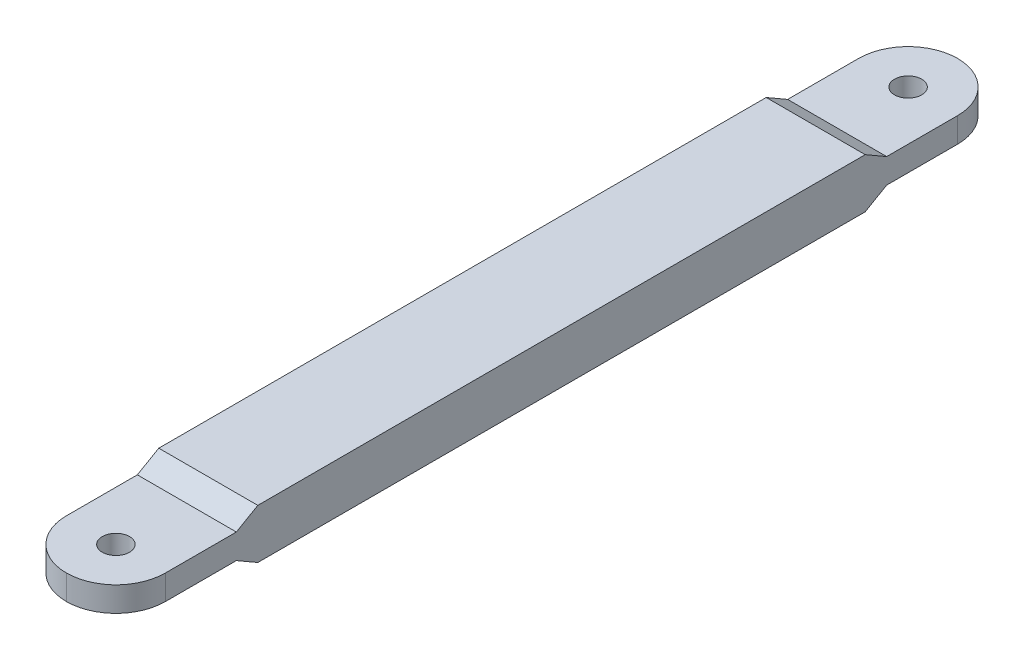
ISO-10303-21;
HEADER;
FILE_DESCRIPTION(('STEP AP214'),'2;1');
FILE_NAME('part.step','',(''),(''),'','','');
FILE_SCHEMA(('AUTOMOTIVE_DESIGN { 1 0 10303 214 1 1 1 1 }'));
ENDSEC;
DATA;
#1=APPLICATION_CONTEXT('core data for automotive mechanical design processes');
#2=APPLICATION_PROTOCOL_DEFINITION('international standard','automotive_design',2000,#1);
#3=PRODUCT_CONTEXT('',#1,'mechanical');
#4=PRODUCT('Part','Part','',(#3));
#5=PRODUCT_RELATED_PRODUCT_CATEGORY('part','',(#4));
#6=PRODUCT_DEFINITION_FORMATION('','',#4);
#7=PRODUCT_DEFINITION_CONTEXT('part definition',#1,'design');
#8=PRODUCT_DEFINITION('design','',#6,#7);
#9=PRODUCT_DEFINITION_SHAPE('','',#8);
#10=(LENGTH_UNIT() NAMED_UNIT(*) SI_UNIT(.MILLI.,.METRE.));
#11=(NAMED_UNIT(*) PLANE_ANGLE_UNIT() SI_UNIT($,.RADIAN.));
#12=(NAMED_UNIT(*) SI_UNIT($,.STERADIAN.) SOLID_ANGLE_UNIT());
#13=UNCERTAINTY_MEASURE_WITH_UNIT(LENGTH_MEASURE(1.E-05),#10,'distance_accuracy_value','');
#14=(GEOMETRIC_REPRESENTATION_CONTEXT(3) GLOBAL_UNCERTAINTY_ASSIGNED_CONTEXT((#13)) GLOBAL_UNIT_ASSIGNED_CONTEXT((#10,
#11,#12)) REPRESENTATION_CONTEXT('',''));
#15=CARTESIAN_POINT('',(0.,0.,0.));
#16=DIRECTION('',(0.,0.,1.));
#17=DIRECTION('',(1.,0.,0.));
#18=AXIS2_PLACEMENT_3D('',#15,#16,#17);
#19=CARTESIAN_POINT('',(-10.,-5.,-70.));
#20=DIRECTION('',(-1.,0.,0.));
#21=DIRECTION('',(0.,0.,1.));
#22=AXIS2_PLACEMENT_3D('',#19,#20,#21);
#23=PLANE('',#22);
#24=DIRECTION('',(0.,0.,-1.));
#25=VECTOR('',#24,1.);
#26=CARTESIAN_POINT('',(-10.,2.5,90.));
#27=LINE('',#26,#25);
#28=CARTESIAN_POINT('',(-10.,2.5,80.));
#29=VERTEX_POINT('',#28);
#30=CARTESIAN_POINT('',(-10.,2.5,65.6698729810777));
#31=VERTEX_POINT('',#30);
#32=EDGE_CURVE('E317',#29,#31,#27,.T.);
#33=ORIENTED_EDGE('',*,*,#32,.T.);
#34=DIRECTION('',(0.,0.499999999999997,-0.866025403784441));
#35=VECTOR('',#34,1.);
#36=CARTESIAN_POINT('',(-10.,59.3717782649104,-32.8349364905394));
#37=LINE('',#36,#35);
#38=CARTESIAN_POINT('',(-10.,5.,61.3397459621554));
#39=VERTEX_POINT('',#38);
#40=EDGE_CURVE('E231',#31,#39,#37,.T.);
#41=ORIENTED_EDGE('',*,*,#40,.T.);
#42=DIRECTION('',(0.,0.,1.));
#43=VECTOR('',#42,1.);
#44=CARTESIAN_POINT('',(-10.,5.,-70.));
#45=LINE('',#44,#43);
#46=CARTESIAN_POINT('',(-10.,5.,-61.3397459621554));
#47=VERTEX_POINT('',#46);
#48=EDGE_CURVE('E168',#47,#39,#45,.T.);
#49=ORIENTED_EDGE('',*,*,#48,.F.);
#50=DIRECTION('',(0.,0.499999999999997,0.866025403784441));
#51=VECTOR('',#50,1.);
#52=CARTESIAN_POINT('',(-10.,-1.25000000000003,-72.1650635094611));
#53=LINE('',#52,#51);
#54=CARTESIAN_POINT('',(-10.,2.5,-65.6698729810777));
#55=VERTEX_POINT('',#54);
#56=EDGE_CURVE('E210',#47,#55,#53,.F.);
#57=ORIENTED_EDGE('',*,*,#56,.T.);
#58=DIRECTION('',(0.,0.,1.));
#59=VECTOR('',#58,1.);
#60=CARTESIAN_POINT('',(-10.,2.5,-90.));
#61=LINE('',#60,#59);
#62=CARTESIAN_POINT('',(-10.,2.5,-80.));
#63=VERTEX_POINT('',#62);
#64=EDGE_CURVE('E160',#63,#55,#61,.T.);
#65=ORIENTED_EDGE('',*,*,#64,.F.);
#66=DIRECTION('',(0.,1.,0.));
#67=VECTOR('',#66,1.);
#68=CARTESIAN_POINT('',(-10.,-5.,-80.));
#69=LINE('',#68,#67);
#70=CARTESIAN_POINT('',(-10.,-2.5,-80.));
#71=VERTEX_POINT('',#70);
#72=EDGE_CURVE('E172',#63,#71,#69,.F.);
#73=ORIENTED_EDGE('',*,*,#72,.T.);
#74=DIRECTION('',(0.,0.,1.));
#75=VECTOR('',#74,1.);
#76=CARTESIAN_POINT('',(-10.,-2.5,-90.));
#77=LINE('',#76,#75);
#78=CARTESIAN_POINT('',(-10.,-2.5,-65.6698729810777));
#79=VERTEX_POINT('',#78);
#80=EDGE_CURVE('E273',#71,#79,#77,.T.);
#81=ORIENTED_EDGE('',*,*,#80,.T.);
#82=DIRECTION('',(0.,0.499999999999997,-0.866025403784441));
#83=VECTOR('',#82,1.);
#84=CARTESIAN_POINT('',(-10.,-1.24999999999994,-67.8349364905389));
#85=LINE('',#84,#83);
#86=CARTESIAN_POINT('',(-10.,-5.,-61.3397459621554));
#87=VERTEX_POINT('',#86);
#88=EDGE_CURVE('E224',#79,#87,#85,.F.);
#89=ORIENTED_EDGE('',*,*,#88,.T.);
#90=DIRECTION('',(0.,0.,1.));
#91=VECTOR('',#90,1.);
#92=CARTESIAN_POINT('',(-10.,-5.,-70.));
#93=LINE('',#92,#91);
#94=CARTESIAN_POINT('',(-10.,-5.,61.3397459621554));
#95=VERTEX_POINT('',#94);
#96=EDGE_CURVE('E178',#87,#95,#93,.T.);
#97=ORIENTED_EDGE('',*,*,#96,.T.);
#98=DIRECTION('',(0.,0.499999999999997,0.866025403784441));
#99=VECTOR('',#98,1.);
#100=CARTESIAN_POINT('',(-10.,-61.8717782649104,-37.1650635094616));
#101=LINE('',#100,#99);
#102=CARTESIAN_POINT('',(-10.,-2.5,65.6698729810777));
#103=VERTEX_POINT('',#102);
#104=EDGE_CURVE('E227',#95,#103,#101,.T.);
#105=ORIENTED_EDGE('',*,*,#104,.T.);
#106=DIRECTION('',(0.,0.,-1.));
#107=VECTOR('',#106,1.);
#108=CARTESIAN_POINT('',(-10.,-2.5,90.));
#109=LINE('',#108,#107);
#110=CARTESIAN_POINT('',(-10.,-2.5,80.));
#111=VERTEX_POINT('',#110);
#112=EDGE_CURVE('E320',#111,#103,#109,.T.);
#113=ORIENTED_EDGE('',*,*,#112,.F.);
#114=DIRECTION('',(0.,1.,0.));
#115=VECTOR('',#114,1.);
#116=CARTESIAN_POINT('',(-10.,-5.,80.));
#117=LINE('',#116,#115);
#118=EDGE_CURVE('E149',#111,#29,#117,.T.);
#119=ORIENTED_EDGE('',*,*,#118,.T.);
#120=EDGE_LOOP('',(#33,#41,#49,#57,#65,#73,#81,#89,#97,#105,#113,#119));
#121=FACE_BOUND('',#120,.T.);
#122=ADVANCED_FACE('F39',(#121),#23,.T.);
#123=CARTESIAN_POINT('',(-10.,5.,-70.));
#124=DIRECTION('',(0.,1.,0.));
#125=DIRECTION('',(0.,0.,1.));
#126=AXIS2_PLACEMENT_3D('',#123,#124,#125);
#127=PLANE('',#126);
#128=ORIENTED_EDGE('',*,*,#48,.T.);
#129=DIRECTION('',(1.,0.,0.));
#130=VECTOR('',#129,1.);
#131=CARTESIAN_POINT('',(10.,5.,61.3397459621554));
#132=LINE('',#131,#130);
#133=CARTESIAN_POINT('',(10.,5.,61.3397459621554));
#134=VERTEX_POINT('',#133);
#135=EDGE_CURVE('E238',#39,#134,#132,.T.);
#136=ORIENTED_EDGE('',*,*,#135,.T.);
#137=DIRECTION('',(0.,0.,1.));
#138=VECTOR('',#137,1.);
#139=CARTESIAN_POINT('',(10.,5.,-70.));
#140=LINE('',#139,#138);
#141=CARTESIAN_POINT('',(10.,5.,-61.3397459621554));
#142=VERTEX_POINT('',#141);
#143=EDGE_CURVE('E175',#142,#134,#140,.T.);
#144=ORIENTED_EDGE('',*,*,#143,.F.);
#145=DIRECTION('',(-1.,0.,0.));
#146=VECTOR('',#145,1.);
#147=CARTESIAN_POINT('',(-10.,5.,-61.3397459621554));
#148=LINE('',#147,#146);
#149=EDGE_CURVE('E234',#142,#47,#148,.T.);
#150=ORIENTED_EDGE('',*,*,#149,.T.);
#151=EDGE_LOOP('',(#128,#136,#144,#150));
#152=FACE_BOUND('',#151,.T.);
#153=ADVANCED_FACE('F300',(#152),#127,.T.);
#154=CARTESIAN_POINT('',(10.,-5.,-70.));
#155=DIRECTION('',(1.,0.,0.));
#156=DIRECTION('',(0.,0.,-1.));
#157=AXIS2_PLACEMENT_3D('',#154,#155,#156);
#158=PLANE('',#157);
#159=DIRECTION('',(0.,-0.499999999999997,0.866025403784441));
#160=VECTOR('',#159,1.);
#161=CARTESIAN_POINT('',(10.,59.3717782649104,-32.8349364905394));
#162=LINE('',#161,#160);
#163=CARTESIAN_POINT('',(10.,2.5,65.6698729810777));
#164=VERTEX_POINT('',#163);
#165=EDGE_CURVE('E251',#134,#164,#162,.T.);
#166=ORIENTED_EDGE('',*,*,#165,.T.);
#167=DIRECTION('',(0.,0.,-1.));
#168=VECTOR('',#167,1.);
#169=CARTESIAN_POINT('',(10.,2.5,90.));
#170=LINE('',#169,#168);
#171=CARTESIAN_POINT('',(10.,2.5,80.));
#172=VERTEX_POINT('',#171);
#173=EDGE_CURVE('E57',#172,#164,#170,.T.);
#174=ORIENTED_EDGE('',*,*,#173,.F.);
#175=DIRECTION('',(0.,-1.,0.));
#176=VECTOR('',#175,1.);
#177=CARTESIAN_POINT('',(10.,-5.,80.));
#178=LINE('',#177,#176);
#179=CARTESIAN_POINT('',(10.,-2.5,80.));
#180=VERTEX_POINT('',#179);
#181=EDGE_CURVE('E207',#172,#180,#178,.T.);
#182=ORIENTED_EDGE('',*,*,#181,.T.);
#183=DIRECTION('',(0.,0.,-1.));
#184=VECTOR('',#183,1.);
#185=CARTESIAN_POINT('',(10.,-2.5,90.));
#186=LINE('',#185,#184);
#187=CARTESIAN_POINT('',(10.,-2.5,65.6698729810777));
#188=VERTEX_POINT('',#187);
#189=EDGE_CURVE('E215',#180,#188,#186,.T.);
#190=ORIENTED_EDGE('',*,*,#189,.T.);
#191=DIRECTION('',(0.,-0.499999999999997,-0.866025403784441));
#192=VECTOR('',#191,1.);
#193=CARTESIAN_POINT('',(10.,-61.8717782649104,-37.1650635094616));
#194=LINE('',#193,#192);
#195=CARTESIAN_POINT('',(10.,-5.,61.3397459621554));
#196=VERTEX_POINT('',#195);
#197=EDGE_CURVE('E248',#188,#196,#194,.T.);
#198=ORIENTED_EDGE('',*,*,#197,.T.);
#199=DIRECTION('',(0.,0.,1.));
#200=VECTOR('',#199,1.);
#201=CARTESIAN_POINT('',(10.,-5.,-70.));
#202=LINE('',#201,#200);
#203=CARTESIAN_POINT('',(10.,-5.,-61.3397459621554));
#204=VERTEX_POINT('',#203);
#205=EDGE_CURVE('E286',#204,#196,#202,.T.);
#206=ORIENTED_EDGE('',*,*,#205,.F.);
#207=DIRECTION('',(0.,-0.499999999999997,0.866025403784441));
#208=VECTOR('',#207,1.);
#209=CARTESIAN_POINT('',(10.,-1.24999999999994,-67.8349364905389));
#210=LINE('',#209,#208);
#211=CARTESIAN_POINT('',(10.,-2.5,-65.6698729810777));
#212=VERTEX_POINT('',#211);
#213=EDGE_CURVE('E245',#204,#212,#210,.F.);
#214=ORIENTED_EDGE('',*,*,#213,.T.);
#215=DIRECTION('',(0.,0.,1.));
#216=VECTOR('',#215,1.);
#217=CARTESIAN_POINT('',(10.,-2.5,-90.));
#218=LINE('',#217,#216);
#219=CARTESIAN_POINT('',(10.,-2.5,-80.));
#220=VERTEX_POINT('',#219);
#221=EDGE_CURVE('E74',#220,#212,#218,.T.);
#222=ORIENTED_EDGE('',*,*,#221,.F.);
#223=DIRECTION('',(0.,-1.,0.));
#224=VECTOR('',#223,1.);
#225=CARTESIAN_POINT('',(10.,-5.,-80.));
#226=LINE('',#225,#224);
#227=CARTESIAN_POINT('',(10.,2.5,-80.));
#228=VERTEX_POINT('',#227);
#229=EDGE_CURVE('E143',#220,#228,#226,.F.);
#230=ORIENTED_EDGE('',*,*,#229,.T.);
#231=DIRECTION('',(0.,0.,1.));
#232=VECTOR('',#231,1.);
#233=CARTESIAN_POINT('',(10.,2.5,-90.));
#234=LINE('',#233,#232);
#235=CARTESIAN_POINT('',(10.,2.5,-65.6698729810777));
#236=VERTEX_POINT('',#235);
#237=EDGE_CURVE('E82',#228,#236,#234,.T.);
#238=ORIENTED_EDGE('',*,*,#237,.T.);
#239=DIRECTION('',(0.,-0.499999999999997,-0.866025403784441));
#240=VECTOR('',#239,1.);
#241=CARTESIAN_POINT('',(10.,-1.25000000000003,-72.1650635094611));
#242=LINE('',#241,#240);
#243=EDGE_CURVE('E242',#236,#142,#242,.F.);
#244=ORIENTED_EDGE('',*,*,#243,.T.);
#245=ORIENTED_EDGE('',*,*,#143,.T.);
#246=EDGE_LOOP('',(#166,#174,#182,#190,#198,#206,#214,#222,#230,#238,#244,#245));
#247=FACE_BOUND('',#246,.T.);
#248=ADVANCED_FACE('F144',(#247),#158,.T.);
#249=CARTESIAN_POINT('',(-10.,-5.,-70.));
#250=DIRECTION('',(0.,-1.,0.));
#251=DIRECTION('',(0.,0.,-1.));
#252=AXIS2_PLACEMENT_3D('',#249,#250,#251);
#253=PLANE('',#252);
#254=ORIENTED_EDGE('',*,*,#205,.T.);
#255=DIRECTION('',(-1.,0.,0.));
#256=VECTOR('',#255,1.);
#257=CARTESIAN_POINT('',(-10.,-5.,61.3397459621554));
#258=LINE('',#257,#256);
#259=EDGE_CURVE('E258',#196,#95,#258,.T.);
#260=ORIENTED_EDGE('',*,*,#259,.T.);
#261=ORIENTED_EDGE('',*,*,#96,.F.);
#262=DIRECTION('',(1.,0.,0.));
#263=VECTOR('',#262,1.);
#264=CARTESIAN_POINT('',(-10.,-5.,-61.3397459621554));
#265=LINE('',#264,#263);
#266=EDGE_CURVE('E254',#87,#204,#265,.T.);
#267=ORIENTED_EDGE('',*,*,#266,.T.);
#268=EDGE_LOOP('',(#254,#260,#261,#267));
#269=FACE_BOUND('',#268,.T.);
#270=ADVANCED_FACE('F282',(#269),#253,.T.);
#271=CARTESIAN_POINT('',(10.,-2.5,-90.));
#272=DIRECTION('',(0.,1.,0.));
#273=DIRECTION('',(0.,0.,1.));
#274=AXIS2_PLACEMENT_3D('',#271,#272,#273);
#275=PLANE('',#274);
#276=CARTESIAN_POINT('',(0.,-2.5,-80.));
#277=DIRECTION('',(0.,1.,0.));
#278=DIRECTION('',(0.,0.,1.));
#279=AXIS2_PLACEMENT_3D('',#276,#277,#278);
#280=CIRCLE('',#279,2.75);
#281=CARTESIAN_POINT('',(0.,-2.5,-77.25));
#282=VERTEX_POINT('',#281);
#283=EDGE_CURVE('E191',#282,#282,#280,.T.);
#284=ORIENTED_EDGE('',*,*,#283,.T.);
#285=EDGE_LOOP('',(#284));
#286=FACE_BOUND('',#285,.T.);
#287=ORIENTED_EDGE('',*,*,#80,.F.);
#288=CARTESIAN_POINT('',(0.,-2.5,-80.));
#289=DIRECTION('',(0.,1.,0.));
#290=DIRECTION('',(0.,0.,1.));
#291=AXIS2_PLACEMENT_3D('',#288,#289,#290);
#292=CIRCLE('',#291,10.);
#293=CARTESIAN_POINT('',(0.,-2.5,-90.));
#294=VERTEX_POINT('',#293);
#295=EDGE_CURVE('E150',#71,#294,#292,.F.);
#296=ORIENTED_EDGE('',*,*,#295,.T.);
#297=CARTESIAN_POINT('',(0.,-2.5,-80.));
#298=DIRECTION('',(0.,1.,0.));
#299=DIRECTION('',(0.,0.,1.));
#300=AXIS2_PLACEMENT_3D('',#297,#298,#299);
#301=CIRCLE('',#300,10.);
#302=EDGE_CURVE('E184',#294,#220,#301,.F.);
#303=ORIENTED_EDGE('',*,*,#302,.T.);
#304=ORIENTED_EDGE('',*,*,#221,.T.);
#305=DIRECTION('',(1.,0.,0.));
#306=VECTOR('',#305,1.);
#307=CARTESIAN_POINT('',(10.,-2.5,-65.6698729810777));
#308=LINE('',#307,#306);
#309=EDGE_CURVE('E49',#212,#79,#308,.F.);
#310=ORIENTED_EDGE('',*,*,#309,.T.);
#311=EDGE_LOOP('',(#287,#296,#303,#304,#310));
#312=FACE_BOUND('',#311,.T.);
#313=ADVANCED_FACE('F272',(#286,#312),#275,.F.);
#314=CARTESIAN_POINT('',(10.,2.5,-90.));
#315=DIRECTION('',(0.,-1.,0.));
#316=DIRECTION('',(0.,0.,-1.));
#317=AXIS2_PLACEMENT_3D('',#314,#315,#316);
#318=PLANE('',#317);
#319=CARTESIAN_POINT('',(0.,2.5,-80.));
#320=DIRECTION('',(0.,1.,0.));
#321=DIRECTION('',(0.,0.,1.));
#322=AXIS2_PLACEMENT_3D('',#319,#320,#321);
#323=CIRCLE('',#322,2.75);
#324=CARTESIAN_POINT('',(0.,2.5,-77.25));
#325=VERTEX_POINT('',#324);
#326=EDGE_CURVE('E311',#325,#325,#323,.T.);
#327=ORIENTED_EDGE('',*,*,#326,.F.);
#328=EDGE_LOOP('',(#327));
#329=FACE_BOUND('',#328,.T.);
#330=CARTESIAN_POINT('',(0.,2.5,-80.));
#331=DIRECTION('',(0.,-1.,0.));
#332=DIRECTION('',(0.,0.,-1.));
#333=AXIS2_PLACEMENT_3D('',#330,#331,#332);
#334=CIRCLE('',#333,10.);
#335=CARTESIAN_POINT('',(0.,2.5,-90.));
#336=VERTEX_POINT('',#335);
#337=EDGE_CURVE('E154',#228,#336,#334,.F.);
#338=ORIENTED_EDGE('',*,*,#337,.T.);
#339=CARTESIAN_POINT('',(0.,2.5,-80.));
#340=DIRECTION('',(0.,-1.,0.));
#341=DIRECTION('',(0.,0.,-1.));
#342=AXIS2_PLACEMENT_3D('',#339,#340,#341);
#343=CIRCLE('',#342,10.);
#344=EDGE_CURVE('E167',#336,#63,#343,.F.);
#345=ORIENTED_EDGE('',*,*,#344,.T.);
#346=ORIENTED_EDGE('',*,*,#64,.T.);
#347=DIRECTION('',(-1.,0.,0.));
#348=VECTOR('',#347,1.);
#349=CARTESIAN_POINT('',(10.,2.5,-65.6698729810777));
#350=LINE('',#349,#348);
#351=EDGE_CURVE('E11',#55,#236,#350,.F.);
#352=ORIENTED_EDGE('',*,*,#351,.T.);
#353=ORIENTED_EDGE('',*,*,#237,.F.);
#354=EDGE_LOOP('',(#338,#345,#346,#352,#353));
#355=FACE_BOUND('',#354,.T.);
#356=ADVANCED_FACE('F153',(#329,#355),#318,.F.);
#357=CARTESIAN_POINT('',(0.,0.,-80.));
#358=DIRECTION('',(0.,-1.,0.));
#359=DIRECTION('',(0.,0.,-1.));
#360=AXIS2_PLACEMENT_3D('',#357,#358,#359);
#361=CYLINDRICAL_SURFACE('',#360,10.);
#362=ORIENTED_EDGE('',*,*,#229,.F.);
#363=ORIENTED_EDGE('',*,*,#302,.F.);
#364=DIRECTION('',(0.,-1.,0.));
#365=VECTOR('',#364,1.);
#366=CARTESIAN_POINT('',(0.,0.,-90.));
#367=LINE('',#366,#365);
#368=EDGE_CURVE('E161',#336,#294,#367,.T.);
#369=ORIENTED_EDGE('',*,*,#368,.F.);
#370=ORIENTED_EDGE('',*,*,#337,.F.);
#371=EDGE_LOOP('',(#362,#363,#369,#370));
#372=FACE_BOUND('',#371,.T.);
#373=ADVANCED_FACE('F163',(#372),#361,.T.);
#374=CARTESIAN_POINT('',(0.,0.,-80.));
#375=DIRECTION('',(0.,1.,0.));
#376=DIRECTION('',(0.,0.,1.));
#377=AXIS2_PLACEMENT_3D('',#374,#375,#376);
#378=CYLINDRICAL_SURFACE('',#377,10.);
#379=ORIENTED_EDGE('',*,*,#295,.F.);
#380=ORIENTED_EDGE('',*,*,#72,.F.);
#381=ORIENTED_EDGE('',*,*,#344,.F.);
#382=ORIENTED_EDGE('',*,*,#368,.T.);
#383=EDGE_LOOP('',(#379,#380,#381,#382));
#384=FACE_BOUND('',#383,.T.);
#385=ADVANCED_FACE('F358',(#384),#378,.T.);
#386=CARTESIAN_POINT('',(0.,-5.,-80.));
#387=DIRECTION('',(0.,1.,0.));
#388=DIRECTION('',(0.,0.,1.));
#389=AXIS2_PLACEMENT_3D('',#386,#387,#388);
#390=CYLINDRICAL_SURFACE('',#389,2.75);
#391=CARTESIAN_POINT('',(0.,2.5,-77.25));
#392=CARTESIAN_POINT('',(0.,2.44791666666667,-77.25));
#393=CARTESIAN_POINT('',(0.,2.39583333333333,-77.25));
#394=CARTESIAN_POINT('',(0.,2.29166666666667,-77.25));
#395=CARTESIAN_POINT('',(0.,2.23958333333333,-77.25));
#396=CARTESIAN_POINT('',(0.,2.13541666666667,-77.25));
#397=CARTESIAN_POINT('',(0.,2.08333333333333,-77.25));
#398=CARTESIAN_POINT('',(0.,1.97916666666667,-77.25));
#399=CARTESIAN_POINT('',(0.,1.92708333333333,-77.25));
#400=CARTESIAN_POINT('',(0.,1.82291666666667,-77.25));
#401=CARTESIAN_POINT('',(0.,1.77083333333333,-77.25));
#402=CARTESIAN_POINT('',(0.,1.66666666666667,-77.25));
#403=CARTESIAN_POINT('',(0.,1.61458333333333,-77.25));
#404=CARTESIAN_POINT('',(0.,1.51041666666667,-77.25));
#405=CARTESIAN_POINT('',(0.,1.45833333333333,-77.25));
#406=CARTESIAN_POINT('',(0.,1.35416666666667,-77.25));
#407=CARTESIAN_POINT('',(0.,1.30208333333333,-77.25));
#408=CARTESIAN_POINT('',(0.,1.19791666666667,-77.25));
#409=CARTESIAN_POINT('',(0.,1.14583333333333,-77.25));
#410=CARTESIAN_POINT('',(0.,1.04166666666667,-77.25));
#411=CARTESIAN_POINT('',(0.,0.989583333333333,-77.25));
#412=CARTESIAN_POINT('',(0.,0.885416666666667,-77.25));
#413=CARTESIAN_POINT('',(0.,0.833333333333333,-77.25));
#414=CARTESIAN_POINT('',(0.,0.729166666666667,-77.25));
#415=CARTESIAN_POINT('',(0.,0.677083333333333,-77.25));
#416=CARTESIAN_POINT('',(0.,0.572916666666666,-77.25));
#417=CARTESIAN_POINT('',(0.,0.520833333333333,-77.25));
#418=CARTESIAN_POINT('',(0.,0.416666666666666,-77.25));
#419=CARTESIAN_POINT('',(0.,0.364583333333333,-77.25));
#420=CARTESIAN_POINT('',(0.,0.260416666666667,-77.25));
#421=CARTESIAN_POINT('',(0.,0.208333333333334,-77.25));
#422=CARTESIAN_POINT('',(0.,0.104166666666667,-77.25));
#423=CARTESIAN_POINT('',(0.,0.0520833333333334,-77.25));
#424=CARTESIAN_POINT('',(0.,-0.0520833333333334,-77.25));
#425=CARTESIAN_POINT('',(0.,-0.104166666666667,-77.25));
#426=CARTESIAN_POINT('',(0.,-0.208333333333334,-77.25));
#427=CARTESIAN_POINT('',(0.,-0.260416666666667,-77.25));
#428=CARTESIAN_POINT('',(0.,-0.364583333333334,-77.25));
#429=CARTESIAN_POINT('',(0.,-0.416666666666667,-77.25));
#430=CARTESIAN_POINT('',(0.,-0.520833333333334,-77.25));
#431=CARTESIAN_POINT('',(0.,-0.572916666666667,-77.25));
#432=CARTESIAN_POINT('',(0.,-0.677083333333334,-77.25));
#433=CARTESIAN_POINT('',(0.,-0.729166666666667,-77.25));
#434=CARTESIAN_POINT('',(0.,-0.833333333333334,-77.25));
#435=CARTESIAN_POINT('',(0.,-0.885416666666668,-77.25));
#436=CARTESIAN_POINT('',(0.,-0.989583333333334,-77.25));
#437=CARTESIAN_POINT('',(0.,-1.04166666666667,-77.25));
#438=CARTESIAN_POINT('',(0.,-1.14583333333333,-77.25));
#439=CARTESIAN_POINT('',(0.,-1.19791666666667,-77.25));
#440=CARTESIAN_POINT('',(0.,-1.30208333333333,-77.25));
#441=CARTESIAN_POINT('',(0.,-1.35416666666667,-77.25));
#442=CARTESIAN_POINT('',(0.,-1.45833333333333,-77.25));
#443=CARTESIAN_POINT('',(0.,-1.51041666666667,-77.25));
#444=CARTESIAN_POINT('',(0.,-1.61458333333333,-77.25));
#445=CARTESIAN_POINT('',(0.,-1.66666666666667,-77.25));
#446=CARTESIAN_POINT('',(0.,-1.77083333333333,-77.25));
#447=CARTESIAN_POINT('',(0.,-1.82291666666667,-77.25));
#448=CARTESIAN_POINT('',(0.,-1.92708333333333,-77.25));
#449=CARTESIAN_POINT('',(0.,-1.97916666666667,-77.25));
#450=CARTESIAN_POINT('',(0.,-2.08333333333333,-77.25));
#451=CARTESIAN_POINT('',(0.,-2.13541666666667,-77.25));
#452=CARTESIAN_POINT('',(0.,-2.23958333333333,-77.25));
#453=CARTESIAN_POINT('',(0.,-2.29166666666667,-77.25));
#454=CARTESIAN_POINT('',(0.,-2.39583333333333,-77.25));
#455=CARTESIAN_POINT('',(0.,-2.44791666666667,-77.25));
#456=CARTESIAN_POINT('',(0.,-2.5,-77.25));
#457=B_SPLINE_CURVE_WITH_KNOTS('',3,(#391,#392,#393,#394,#395,#396,#397,#398,#399,#400,#401,
#402,#403,#404,#405,#406,#407,#408,#409,#410,#411,#412,#413,#414,#415,#416,#417,#418,#419,#420,
#421,#422,#423,#424,#425,#426,#427,#428,#429,#430,#431,#432,#433,#434,#435,#436,#437,#438,#439,
#440,#441,#442,#443,#444,#445,#446,#447,#448,#449,#450,#451,#452,#453,#454,#455,#456),
.UNSPECIFIED.,.F.,.F.,(4,2,2,2,2,2,2,2,2,2,2,2,2,2,2,2,2,2,2,2,2,2,2,2,2,2,2,2,2,2,2,2,4),(0.,
0.15625,0.3125,0.46875,0.625000000000001,0.781250000000001,0.937500000000001,1.09375,1.25,
1.40625,1.5625,1.71875,1.875,2.03125,2.1875,2.34375,2.5,2.65625,2.8125,2.96875,3.125,3.28125,
3.4375,3.59375,3.75,3.90625,4.0625,4.21875,4.375,4.53125,4.6875,4.84375,5.),.UNSPECIFIED.);
#458=EDGE_CURVE('BSEAM361',#325,#282,#457,.T.);
#459=ORIENTED_EDGE('',*,*,#326,.T.);
#460=ORIENTED_EDGE('',*,*,#283,.F.);
#461=ORIENTED_EDGE('',*,*,#458,.T.);
#462=ORIENTED_EDGE('',*,*,#458,.F.);
#463=EDGE_LOOP('',(#459,#461,#460,#462));
#464=FACE_BOUND('',#463,.T.);
#465=ADVANCED_FACE('F361',(#464),#390,.F.);
#466=CARTESIAN_POINT('',(10.,2.5,90.));
#467=DIRECTION('',(0.,1.,0.));
#468=DIRECTION('',(0.,0.,1.));
#469=AXIS2_PLACEMENT_3D('',#466,#467,#468);
#470=PLANE('',#469);
#471=CARTESIAN_POINT('',(0.,2.5,80.));
#472=DIRECTION('',(0.,-1.,0.));
#473=DIRECTION('',(0.,0.,-1.));
#474=AXIS2_PLACEMENT_3D('',#471,#472,#473);
#475=CIRCLE('',#474,2.75);
#476=CARTESIAN_POINT('',(0.,2.5,82.75));
#477=VERTEX_POINT('',#476);
#478=EDGE_CURVE('E220',#477,#477,#475,.T.);
#479=ORIENTED_EDGE('',*,*,#478,.T.);
#480=EDGE_LOOP('',(#479));
#481=FACE_BOUND('',#480,.T.);
#482=ORIENTED_EDGE('',*,*,#32,.F.);
#483=CARTESIAN_POINT('',(0.,2.5,80.));
#484=DIRECTION('',(0.,1.,0.));
#485=DIRECTION('',(0.,0.,1.));
#486=AXIS2_PLACEMENT_3D('',#483,#484,#485);
#487=CIRCLE('',#486,10.);
#488=CARTESIAN_POINT('',(0.,2.5,90.));
#489=VERTEX_POINT('',#488);
#490=EDGE_CURVE('E198',#29,#489,#487,.T.);
#491=ORIENTED_EDGE('',*,*,#490,.T.);
#492=CARTESIAN_POINT('',(0.,2.5,80.));
#493=DIRECTION('',(0.,1.,0.));
#494=DIRECTION('',(0.,0.,1.));
#495=AXIS2_PLACEMENT_3D('',#492,#493,#494);
#496=CIRCLE('',#495,10.);
#497=EDGE_CURVE('E195',#489,#172,#496,.T.);
#498=ORIENTED_EDGE('',*,*,#497,.T.);
#499=ORIENTED_EDGE('',*,*,#173,.T.);
#500=DIRECTION('',(-1.,0.,0.));
#501=VECTOR('',#500,1.);
#502=CARTESIAN_POINT('',(0.,2.5,65.6698729810777));
#503=LINE('',#502,#501);
#504=EDGE_CURVE('E262',#164,#31,#503,.T.);
#505=ORIENTED_EDGE('',*,*,#504,.T.);
#506=EDGE_LOOP('',(#482,#491,#498,#499,#505));
#507=FACE_BOUND('',#506,.T.);
#508=ADVANCED_FACE('F329',(#481,#507),#470,.T.);
#509=CARTESIAN_POINT('',(10.,-2.5,90.));
#510=DIRECTION('',(0.,-1.,0.));
#511=DIRECTION('',(0.,0.,-1.));
#512=AXIS2_PLACEMENT_3D('',#509,#510,#511);
#513=PLANE('',#512);
#514=CARTESIAN_POINT('',(0.,-2.5,80.));
#515=DIRECTION('',(0.,-1.,0.));
#516=DIRECTION('',(0.,0.,-1.));
#517=AXIS2_PLACEMENT_3D('',#514,#515,#516);
#518=CIRCLE('',#517,2.75);
#519=CARTESIAN_POINT('',(0.,-2.5,82.75));
#520=VERTEX_POINT('',#519);
#521=EDGE_CURVE('E216',#520,#520,#518,.F.);
#522=ORIENTED_EDGE('',*,*,#521,.T.);
#523=EDGE_LOOP('',(#522));
#524=FACE_BOUND('',#523,.T.);
#525=CARTESIAN_POINT('',(0.,-2.5,80.));
#526=DIRECTION('',(0.,-1.,0.));
#527=DIRECTION('',(0.,0.,-1.));
#528=AXIS2_PLACEMENT_3D('',#525,#526,#527);
#529=CIRCLE('',#528,10.);
#530=CARTESIAN_POINT('',(0.,-2.5,90.));
#531=VERTEX_POINT('',#530);
#532=EDGE_CURVE('E201',#180,#531,#529,.T.);
#533=ORIENTED_EDGE('',*,*,#532,.T.);
#534=CARTESIAN_POINT('',(0.,-2.5,80.));
#535=DIRECTION('',(0.,-1.,0.));
#536=DIRECTION('',(0.,0.,-1.));
#537=AXIS2_PLACEMENT_3D('',#534,#535,#536);
#538=CIRCLE('',#537,10.);
#539=EDGE_CURVE('E204',#531,#111,#538,.T.);
#540=ORIENTED_EDGE('',*,*,#539,.T.);
#541=ORIENTED_EDGE('',*,*,#112,.T.);
#542=DIRECTION('',(1.,0.,0.));
#543=VECTOR('',#542,1.);
#544=CARTESIAN_POINT('',(0.,-2.5,65.6698729810777));
#545=LINE('',#544,#543);
#546=EDGE_CURVE('E265',#103,#188,#545,.T.);
#547=ORIENTED_EDGE('',*,*,#546,.T.);
#548=ORIENTED_EDGE('',*,*,#189,.F.);
#549=EDGE_LOOP('',(#533,#540,#541,#547,#548));
#550=FACE_BOUND('',#549,.T.);
#551=ADVANCED_FACE('F366',(#524,#550),#513,.T.);
#552=CARTESIAN_POINT('',(0.,-5.,80.));
#553=DIRECTION('',(0.,-1.,0.));
#554=DIRECTION('',(0.,0.,-1.));
#555=AXIS2_PLACEMENT_3D('',#552,#553,#554);
#556=CYLINDRICAL_SURFACE('',#555,10.);
#557=DIRECTION('',(0.,-1.,0.));
#558=VECTOR('',#557,1.);
#559=CARTESIAN_POINT('',(0.,0.,90.));
#560=LINE('',#559,#558);
#561=EDGE_CURVE('E211',#531,#489,#560,.F.);
#562=ORIENTED_EDGE('',*,*,#561,.F.);
#563=ORIENTED_EDGE('',*,*,#532,.F.);
#564=ORIENTED_EDGE('',*,*,#181,.F.);
#565=ORIENTED_EDGE('',*,*,#497,.F.);
#566=EDGE_LOOP('',(#562,#563,#564,#565));
#567=FACE_BOUND('',#566,.T.);
#568=ADVANCED_FACE('F344',(#567),#556,.T.);
#569=CARTESIAN_POINT('',(0.,-5.,80.));
#570=DIRECTION('',(0.,1.,0.));
#571=DIRECTION('',(0.,0.,1.));
#572=AXIS2_PLACEMENT_3D('',#569,#570,#571);
#573=CYLINDRICAL_SURFACE('',#572,10.);
#574=ORIENTED_EDGE('',*,*,#539,.F.);
#575=ORIENTED_EDGE('',*,*,#561,.T.);
#576=ORIENTED_EDGE('',*,*,#490,.F.);
#577=ORIENTED_EDGE('',*,*,#118,.F.);
#578=EDGE_LOOP('',(#574,#575,#576,#577));
#579=FACE_BOUND('',#578,.T.);
#580=ADVANCED_FACE('F334',(#579),#573,.T.);
#581=CARTESIAN_POINT('',(0.,-5.,80.));
#582=DIRECTION('',(0.,1.,0.));
#583=DIRECTION('',(0.,0.,1.));
#584=AXIS2_PLACEMENT_3D('',#581,#582,#583);
#585=CYLINDRICAL_SURFACE('',#584,2.75);
#586=CARTESIAN_POINT('',(0.,-2.5,82.75));
#587=CARTESIAN_POINT('',(0.,-2.44791666666667,82.75));
#588=CARTESIAN_POINT('',(0.,-2.39583333333333,82.75));
#589=CARTESIAN_POINT('',(0.,-2.29166666666667,82.75));
#590=CARTESIAN_POINT('',(0.,-2.23958333333333,82.75));
#591=CARTESIAN_POINT('',(0.,-2.13541666666667,82.75));
#592=CARTESIAN_POINT('',(0.,-2.08333333333333,82.75));
#593=CARTESIAN_POINT('',(0.,-1.97916666666667,82.75));
#594=CARTESIAN_POINT('',(0.,-1.92708333333333,82.75));
#595=CARTESIAN_POINT('',(0.,-1.82291666666667,82.75));
#596=CARTESIAN_POINT('',(0.,-1.77083333333333,82.75));
#597=CARTESIAN_POINT('',(0.,-1.66666666666667,82.75));
#598=CARTESIAN_POINT('',(0.,-1.61458333333333,82.75));
#599=CARTESIAN_POINT('',(0.,-1.51041666666667,82.75));
#600=CARTESIAN_POINT('',(0.,-1.45833333333333,82.75));
#601=CARTESIAN_POINT('',(0.,-1.35416666666667,82.75));
#602=CARTESIAN_POINT('',(0.,-1.30208333333333,82.75));
#603=CARTESIAN_POINT('',(0.,-1.19791666666667,82.75));
#604=CARTESIAN_POINT('',(0.,-1.14583333333333,82.75));
#605=CARTESIAN_POINT('',(0.,-1.04166666666667,82.75));
#606=CARTESIAN_POINT('',(0.,-0.989583333333333,82.75));
#607=CARTESIAN_POINT('',(0.,-0.885416666666667,82.75));
#608=CARTESIAN_POINT('',(0.,-0.833333333333334,82.75));
#609=CARTESIAN_POINT('',(0.,-0.729166666666667,82.75));
#610=CARTESIAN_POINT('',(0.,-0.677083333333334,82.75));
#611=CARTESIAN_POINT('',(0.,-0.572916666666667,82.75));
#612=CARTESIAN_POINT('',(0.,-0.520833333333334,82.75));
#613=CARTESIAN_POINT('',(0.,-0.416666666666667,82.75));
#614=CARTESIAN_POINT('',(0.,-0.364583333333334,82.75));
#615=CARTESIAN_POINT('',(0.,-0.260416666666667,82.75));
#616=CARTESIAN_POINT('',(0.,-0.208333333333334,82.75));
#617=CARTESIAN_POINT('',(0.,-0.104166666666667,82.75));
#618=CARTESIAN_POINT('',(0.,-0.0520833333333334,82.75));
#619=CARTESIAN_POINT('',(0.,0.0520833333333334,82.75));
#620=CARTESIAN_POINT('',(0.,0.104166666666667,82.75));
#621=CARTESIAN_POINT('',(0.,0.208333333333334,82.75));
#622=CARTESIAN_POINT('',(0.,0.260416666666667,82.75));
#623=CARTESIAN_POINT('',(0.,0.364583333333334,82.75));
#624=CARTESIAN_POINT('',(0.,0.416666666666667,82.75));
#625=CARTESIAN_POINT('',(0.,0.520833333333334,82.75));
#626=CARTESIAN_POINT('',(0.,0.572916666666667,82.75));
#627=CARTESIAN_POINT('',(0.,0.677083333333334,82.75));
#628=CARTESIAN_POINT('',(0.,0.729166666666667,82.75));
#629=CARTESIAN_POINT('',(0.,0.833333333333334,82.75));
#630=CARTESIAN_POINT('',(0.,0.885416666666667,82.75));
#631=CARTESIAN_POINT('',(0.,0.989583333333333,82.75));
#632=CARTESIAN_POINT('',(0.,1.04166666666667,82.75));
#633=CARTESIAN_POINT('',(0.,1.14583333333333,82.75));
#634=CARTESIAN_POINT('',(0.,1.19791666666667,82.75));
#635=CARTESIAN_POINT('',(0.,1.30208333333333,82.75));
#636=CARTESIAN_POINT('',(0.,1.35416666666667,82.75));
#637=CARTESIAN_POINT('',(0.,1.45833333333333,82.75));
#638=CARTESIAN_POINT('',(0.,1.51041666666667,82.75));
#639=CARTESIAN_POINT('',(0.,1.61458333333333,82.75));
#640=CARTESIAN_POINT('',(0.,1.66666666666667,82.75));
#641=CARTESIAN_POINT('',(0.,1.77083333333333,82.75));
#642=CARTESIAN_POINT('',(0.,1.82291666666667,82.75));
#643=CARTESIAN_POINT('',(0.,1.92708333333333,82.75));
#644=CARTESIAN_POINT('',(0.,1.97916666666667,82.75));
#645=CARTESIAN_POINT('',(0.,2.08333333333333,82.75));
#646=CARTESIAN_POINT('',(0.,2.13541666666667,82.75));
#647=CARTESIAN_POINT('',(0.,2.23958333333333,82.75));
#648=CARTESIAN_POINT('',(0.,2.29166666666667,82.75));
#649=CARTESIAN_POINT('',(0.,2.39583333333333,82.75));
#650=CARTESIAN_POINT('',(0.,2.44791666666667,82.75));
#651=CARTESIAN_POINT('',(0.,2.5,82.75));
#652=B_SPLINE_CURVE_WITH_KNOTS('',3,(#586,#587,#588,#589,#590,#591,#592,#593,#594,#595,#596,
#597,#598,#599,#600,#601,#602,#603,#604,#605,#606,#607,#608,#609,#610,#611,#612,#613,#614,#615,
#616,#617,#618,#619,#620,#621,#622,#623,#624,#625,#626,#627,#628,#629,#630,#631,#632,#633,#634,
#635,#636,#637,#638,#639,#640,#641,#642,#643,#644,#645,#646,#647,#648,#649,#650,#651),
.UNSPECIFIED.,.F.,.F.,(4,2,2,2,2,2,2,2,2,2,2,2,2,2,2,2,2,2,2,2,2,2,2,2,2,2,2,2,2,2,2,2,4),(0.,
0.15625,0.3125,0.46875,0.625,0.78125,0.9375,1.09375,1.25,1.40625,1.5625,1.71875,1.875,2.03125,
2.1875,2.34375,2.5,2.65625,2.8125,2.96875,3.125,3.28125,3.4375,3.59375,3.75,3.90625,4.0625,
4.21875,4.375,4.53125,4.6875,4.84375,5.),.UNSPECIFIED.);
#653=EDGE_CURVE('BSEAM331',#520,#477,#652,.T.);
#654=ORIENTED_EDGE('',*,*,#521,.F.);
#655=ORIENTED_EDGE('',*,*,#478,.F.);
#656=ORIENTED_EDGE('',*,*,#653,.T.);
#657=ORIENTED_EDGE('',*,*,#653,.F.);
#658=EDGE_LOOP('',(#654,#656,#655,#657));
#659=FACE_BOUND('',#658,.T.);
#660=ADVANCED_FACE('F331',(#659),#585,.F.);
#661=CARTESIAN_POINT('',(0.,0.,70.));
#662=DIRECTION('',(0.,0.866025403784441,0.499999999999997));
#663=DIRECTION('',(1.,0.,0.));
#664=AXIS2_PLACEMENT_3D('',#661,#662,#663);
#665=PLANE('',#664);
#666=ORIENTED_EDGE('',*,*,#165,.F.);
#667=ORIENTED_EDGE('',*,*,#135,.F.);
#668=ORIENTED_EDGE('',*,*,#40,.F.);
#669=ORIENTED_EDGE('',*,*,#504,.F.);
#670=EDGE_LOOP('',(#666,#667,#668,#669));
#671=FACE_BOUND('',#670,.T.);
#672=ADVANCED_FACE('F333',(#671),#665,.T.);
#673=CARTESIAN_POINT('',(0.,0.,70.));
#674=DIRECTION('',(0.,-0.866025403784441,0.499999999999997));
#675=DIRECTION('',(-1.,0.,0.));
#676=AXIS2_PLACEMENT_3D('',#673,#674,#675);
#677=PLANE('',#676);
#678=ORIENTED_EDGE('',*,*,#104,.F.);
#679=ORIENTED_EDGE('',*,*,#259,.F.);
#680=ORIENTED_EDGE('',*,*,#197,.F.);
#681=ORIENTED_EDGE('',*,*,#546,.F.);
#682=EDGE_LOOP('',(#678,#679,#680,#681));
#683=FACE_BOUND('',#682,.T.);
#684=ADVANCED_FACE('F341',(#683),#677,.T.);
#685=CARTESIAN_POINT('',(-10.,-5.,-61.3397459621554));
#686=DIRECTION('',(0.,0.866025403784441,0.499999999999996));
#687=DIRECTION('',(1.,0.,0.));
#688=AXIS2_PLACEMENT_3D('',#685,#686,#687);
#689=PLANE('',#688);
#690=ORIENTED_EDGE('',*,*,#88,.F.);
#691=ORIENTED_EDGE('',*,*,#309,.F.);
#692=ORIENTED_EDGE('',*,*,#213,.F.);
#693=ORIENTED_EDGE('',*,*,#266,.F.);
#694=EDGE_LOOP('',(#690,#691,#692,#693));
#695=FACE_BOUND('',#694,.T.);
#696=ADVANCED_FACE('F276',(#695),#689,.F.);
#697=CARTESIAN_POINT('',(-10.,5.,-61.3397459621554));
#698=DIRECTION('',(0.,-0.866025403784441,0.499999999999996));
#699=DIRECTION('',(-1.,0.,0.));
#700=AXIS2_PLACEMENT_3D('',#697,#698,#699);
#701=PLANE('',#700);
#702=ORIENTED_EDGE('',*,*,#243,.F.);
#703=ORIENTED_EDGE('',*,*,#351,.F.);
#704=ORIENTED_EDGE('',*,*,#56,.F.);
#705=ORIENTED_EDGE('',*,*,#149,.F.);
#706=EDGE_LOOP('',(#702,#703,#704,#705));
#707=FACE_BOUND('',#706,.T.);
#708=ADVANCED_FACE('F41',(#707),#701,.F.);
#709=CLOSED_SHELL('',(#122,#153,#248,#270,#313,#356,#373,#385,#465,#508,#551,#568,#580,#660,
#672,#684,#696,#708));
#710=MANIFOLD_SOLID_BREP('B2',#709);
#711=ADVANCED_BREP_SHAPE_REPRESENTATION('',(#18,#710),#14);
#712=SHAPE_DEFINITION_REPRESENTATION(#9,#711);
ENDSEC;
END-ISO-10303-21;
